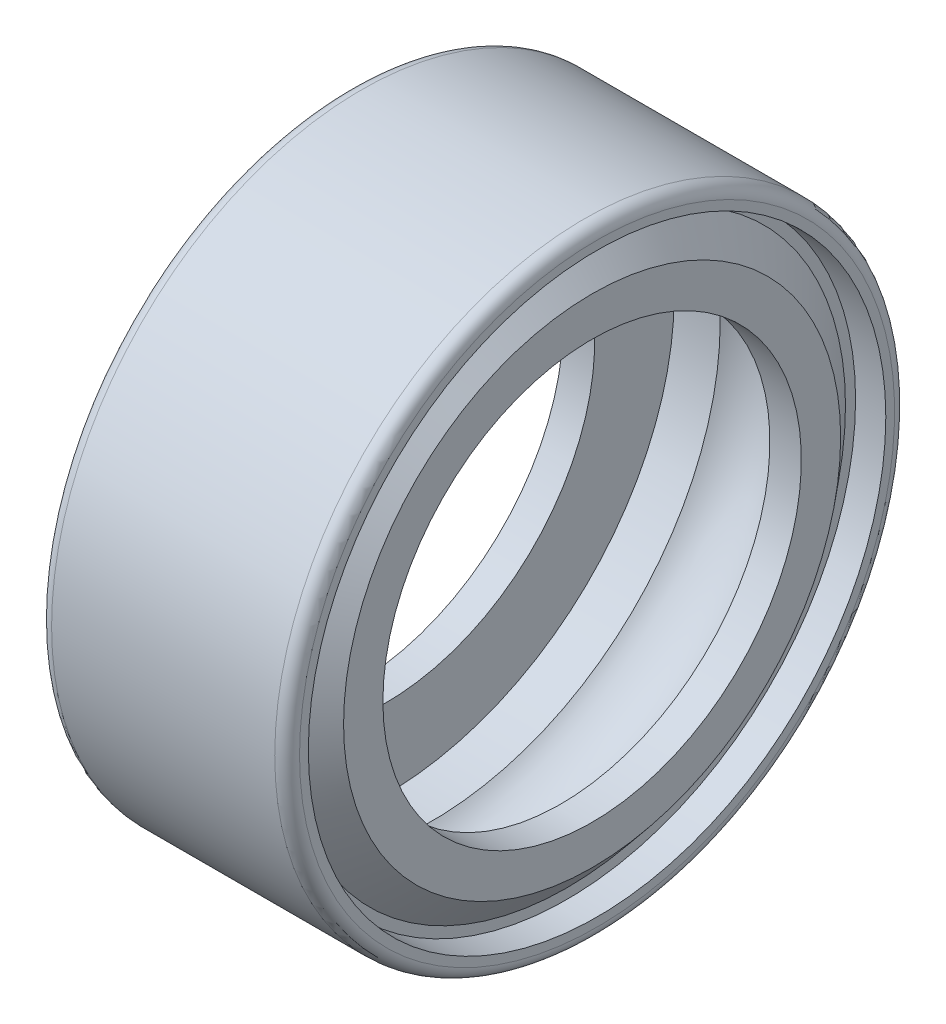
ISO-10303-21;
HEADER;
FILE_DESCRIPTION(('STEP AP214'),'2;1');
FILE_NAME('part.step','',(''),(''),'','','');
FILE_SCHEMA(('AUTOMOTIVE_DESIGN { 1 0 10303 214 1 1 1 1 }'));
ENDSEC;
DATA;
#1=APPLICATION_CONTEXT('core data for automotive mechanical design processes');
#2=APPLICATION_PROTOCOL_DEFINITION('international standard','automotive_design',2000,#1);
#3=PRODUCT_CONTEXT('',#1,'mechanical');
#4=PRODUCT('Part','Part','',(#3));
#5=PRODUCT_RELATED_PRODUCT_CATEGORY('part','',(#4));
#6=PRODUCT_DEFINITION_FORMATION('','',#4);
#7=PRODUCT_DEFINITION_CONTEXT('part definition',#1,'design');
#8=PRODUCT_DEFINITION('design','',#6,#7);
#9=PRODUCT_DEFINITION_SHAPE('','',#8);
#10=(LENGTH_UNIT() NAMED_UNIT(*) SI_UNIT(.MILLI.,.METRE.));
#11=(NAMED_UNIT(*) PLANE_ANGLE_UNIT() SI_UNIT($,.RADIAN.));
#12=(NAMED_UNIT(*) SI_UNIT($,.STERADIAN.) SOLID_ANGLE_UNIT());
#13=UNCERTAINTY_MEASURE_WITH_UNIT(LENGTH_MEASURE(1.E-05),#10,'distance_accuracy_value','');
#14=(GEOMETRIC_REPRESENTATION_CONTEXT(3) GLOBAL_UNCERTAINTY_ASSIGNED_CONTEXT((#13)) GLOBAL_UNIT_ASSIGNED_CONTEXT((#10,
#11,#12)) REPRESENTATION_CONTEXT('',''));
#15=CARTESIAN_POINT('',(0.,0.,0.));
#16=DIRECTION('',(0.,0.,1.));
#17=DIRECTION('',(1.,0.,0.));
#18=AXIS2_PLACEMENT_3D('',#15,#16,#17);
#19=CARTESIAN_POINT('',(-1.524,2.679239625,0.));
#20=DIRECTION('',(-1.,0.,0.));
#21=DIRECTION('',(0.,0.,1.));
#22=AXIS2_PLACEMENT_3D('',#19,#20,#21);
#23=PLANE('',#22);
#24=CARTESIAN_POINT('',(-1.524,0.,0.));
#25=DIRECTION('',(-1.,0.,0.));
#26=DIRECTION('',(0.,0.,1.));
#27=AXIS2_PLACEMENT_3D('',#24,#25,#26);
#28=CIRCLE('',#27,3.18255113425);
#29=CARTESIAN_POINT('',(-1.524,0.,3.18255113425));
#30=VERTEX_POINT('',#29);
#31=EDGE_CURVE('E10',#30,#30,#28,.T.);
#32=ORIENTED_EDGE('',*,*,#31,.T.);
#33=EDGE_LOOP('',(#32));
#34=FACE_BOUND('',#33,.T.);
#35=CARTESIAN_POINT('',(-1.524,0.,0.));
#36=DIRECTION('',(-1.,0.,0.));
#37=DIRECTION('',(0.,0.,1.));
#38=AXIS2_PLACEMENT_3D('',#35,#36,#37);
#39=CIRCLE('',#38,2.679239625);
#40=CARTESIAN_POINT('',(-1.524,0.,2.679239625));
#41=VERTEX_POINT('',#40);
#42=EDGE_CURVE('E97',#41,#41,#39,.T.);
#43=ORIENTED_EDGE('',*,*,#42,.F.);
#44=EDGE_LOOP('',(#43));
#45=FACE_BOUND('',#44,.T.);
#46=ADVANCED_FACE('F33',(#34,#45),#23,.T.);
#47=CARTESIAN_POINT('',(-1.524,0.,0.));
#48=DIRECTION('',(1.,0.,0.));
#49=DIRECTION('',(0.,0.,-1.));
#50=AXIS2_PLACEMENT_3D('',#47,#48,#49);
#51=CONICAL_SURFACE('',#50,3.18255113425,0.872664625997174);
#52=CARTESIAN_POINT('',(-1.20066864556187,0.,0.));
#53=DIRECTION('',(-1.,0.,0.));
#54=DIRECTION('',(0.,0.,1.));
#55=AXIS2_PLACEMENT_3D('',#52,#53,#54);
#56=CIRCLE('',#55,3.5678824375);
#57=CARTESIAN_POINT('',(-1.20066864556187,0.,3.5678824375));
#58=VERTEX_POINT('',#57);
#59=EDGE_CURVE('E39',#58,#58,#56,.T.);
#60=ORIENTED_EDGE('',*,*,#59,.T.);
#61=EDGE_LOOP('',(#60));
#62=FACE_BOUND('',#61,.T.);
#63=ORIENTED_EDGE('',*,*,#31,.F.);
#64=EDGE_LOOP('',(#63));
#65=FACE_BOUND('',#64,.T.);
#66=ADVANCED_FACE('F105',(#62,#65),#51,.T.);
#67=CARTESIAN_POINT('',(-1.20066864556187,3.5678824375,0.));
#68=DIRECTION('',(-1.,0.,0.));
#69=DIRECTION('',(0.,0.,1.));
#70=AXIS2_PLACEMENT_3D('',#67,#68,#69);
#71=PLANE('',#70);
#72=CARTESIAN_POINT('',(-1.20066864556186,0.,0.));
#73=DIRECTION('',(-1.,0.,0.));
#74=DIRECTION('',(0.,0.,1.));
#75=AXIS2_PLACEMENT_3D('',#72,#73,#74);
#76=CIRCLE('',#75,3.6972875);
#77=CARTESIAN_POINT('',(-1.20066864556186,0.,3.6972875));
#78=VERTEX_POINT('',#77);
#79=EDGE_CURVE('E43',#78,#78,#76,.T.);
#80=ORIENTED_EDGE('',*,*,#79,.T.);
#81=EDGE_LOOP('',(#80));
#82=FACE_BOUND('',#81,.T.);
#83=ORIENTED_EDGE('',*,*,#59,.F.);
#84=EDGE_LOOP('',(#83));
#85=FACE_BOUND('',#84,.T.);
#86=ADVANCED_FACE('F109',(#82,#85),#71,.T.);
#87=CARTESIAN_POINT('',(1.5875,0.,0.));
#88=DIRECTION('',(-1.,0.,0.));
#89=DIRECTION('',(0.,0.,1.));
#90=AXIS2_PLACEMENT_3D('',#87,#88,#89);
#91=CYLINDRICAL_SURFACE('',#90,3.6972875);
#92=CARTESIAN_POINT('',(-1.5875,0.,0.));
#93=DIRECTION('',(-1.,0.,0.));
#94=DIRECTION('',(0.,0.,1.));
#95=AXIS2_PLACEMENT_3D('',#92,#93,#94);
#96=CIRCLE('',#95,3.6972875);
#97=CARTESIAN_POINT('',(-1.5875,0.,3.6972875));
#98=VERTEX_POINT('',#97);
#99=EDGE_CURVE('E47',#98,#98,#96,.T.);
#100=ORIENTED_EDGE('',*,*,#99,.T.);
#101=EDGE_LOOP('',(#100));
#102=FACE_BOUND('',#101,.T.);
#103=ORIENTED_EDGE('',*,*,#79,.F.);
#104=EDGE_LOOP('',(#103));
#105=FACE_BOUND('',#104,.T.);
#106=ADVANCED_FACE('F113',(#102,#105),#91,.F.);
#107=CARTESIAN_POINT('',(-1.5875,3.6972875,0.));
#108=DIRECTION('',(-1.,0.,0.));
#109=DIRECTION('',(0.,0.,1.));
#110=AXIS2_PLACEMENT_3D('',#107,#108,#109);
#111=PLANE('',#110);
#112=CARTESIAN_POINT('',(-1.5875,0.,0.));
#113=DIRECTION('',(-1.,0.,0.));
#114=DIRECTION('',(0.,0.,1.));
#115=AXIS2_PLACEMENT_3D('',#112,#113,#114);
#116=CIRCLE('',#115,3.81);
#117=CARTESIAN_POINT('',(-1.5875,0.,3.81));
#118=VERTEX_POINT('',#117);
#119=EDGE_CURVE('E52',#118,#118,#116,.T.);
#120=ORIENTED_EDGE('',*,*,#119,.T.);
#121=EDGE_LOOP('',(#120));
#122=FACE_BOUND('',#121,.T.);
#123=ORIENTED_EDGE('',*,*,#99,.F.);
#124=EDGE_LOOP('',(#123));
#125=FACE_BOUND('',#124,.T.);
#126=ADVANCED_FACE('F120',(#122,#125),#111,.T.);
#127=CARTESIAN_POINT('',(-1.42875,0.,0.));
#128=DIRECTION('',(-1.,0.,0.));
#129=DIRECTION('',(0.,0.,1.));
#130=AXIS2_PLACEMENT_3D('',#127,#128,#129);
#131=TOROIDAL_SURFACE('',#130,3.81,0.15875);
#132=CARTESIAN_POINT('',(-1.42875,0.,0.));
#133=DIRECTION('',(-1.,0.,0.));
#134=DIRECTION('',(0.,0.,1.));
#135=AXIS2_PLACEMENT_3D('',#132,#133,#134);
#136=CIRCLE('',#135,3.96875);
#137=CARTESIAN_POINT('',(-1.42875,0.,3.96875));
#138=VERTEX_POINT('',#137);
#139=EDGE_CURVE('E55',#138,#138,#136,.T.);
#140=ORIENTED_EDGE('',*,*,#139,.T.);
#141=EDGE_LOOP('',(#140));
#142=FACE_BOUND('',#141,.T.);
#143=ORIENTED_EDGE('',*,*,#119,.F.);
#144=EDGE_LOOP('',(#143));
#145=FACE_BOUND('',#144,.T.);
#146=ADVANCED_FACE('F124',(#142,#145),#131,.T.);
#147=CARTESIAN_POINT('',(1.5875,0.,0.));
#148=DIRECTION('',(-1.,0.,0.));
#149=DIRECTION('',(0.,0.,1.));
#150=AXIS2_PLACEMENT_3D('',#147,#148,#149);
#151=CYLINDRICAL_SURFACE('',#150,3.96875);
#152=CARTESIAN_POINT('',(1.42875,0.,0.));
#153=DIRECTION('',(-1.,0.,0.));
#154=DIRECTION('',(0.,0.,1.));
#155=AXIS2_PLACEMENT_3D('',#152,#153,#154);
#156=CIRCLE('',#155,3.96875);
#157=CARTESIAN_POINT('',(1.42875,0.,3.96875));
#158=VERTEX_POINT('',#157);
#159=EDGE_CURVE('E58',#158,#158,#156,.T.);
#160=ORIENTED_EDGE('',*,*,#159,.T.);
#161=EDGE_LOOP('',(#160));
#162=FACE_BOUND('',#161,.T.);
#163=ORIENTED_EDGE('',*,*,#139,.F.);
#164=EDGE_LOOP('',(#163));
#165=FACE_BOUND('',#164,.T.);
#166=ADVANCED_FACE('F128',(#162,#165),#151,.T.);
#167=CARTESIAN_POINT('',(1.42875,0.,0.));
#168=DIRECTION('',(-1.,0.,0.));
#169=DIRECTION('',(0.,0.,1.));
#170=AXIS2_PLACEMENT_3D('',#167,#168,#169);
#171=TOROIDAL_SURFACE('',#170,3.81,0.15875);
#172=CARTESIAN_POINT('',(1.5875,0.,0.));
#173=DIRECTION('',(-1.,0.,0.));
#174=DIRECTION('',(0.,0.,1.));
#175=AXIS2_PLACEMENT_3D('',#172,#173,#174);
#176=CIRCLE('',#175,3.81);
#177=CARTESIAN_POINT('',(1.5875,0.,3.81));
#178=VERTEX_POINT('',#177);
#179=EDGE_CURVE('E61',#178,#178,#176,.T.);
#180=ORIENTED_EDGE('',*,*,#179,.T.);
#181=EDGE_LOOP('',(#180));
#182=FACE_BOUND('',#181,.T.);
#183=ORIENTED_EDGE('',*,*,#159,.F.);
#184=EDGE_LOOP('',(#183));
#185=FACE_BOUND('',#184,.T.);
#186=ADVANCED_FACE('F132',(#182,#185),#171,.T.);
#187=CARTESIAN_POINT('',(1.5875,3.81,0.));
#188=DIRECTION('',(1.,0.,0.));
#189=DIRECTION('',(0.,0.,-1.));
#190=AXIS2_PLACEMENT_3D('',#187,#188,#189);
#191=PLANE('',#190);
#192=CARTESIAN_POINT('',(1.5875,0.,0.));
#193=DIRECTION('',(-1.,0.,0.));
#194=DIRECTION('',(0.,0.,1.));
#195=AXIS2_PLACEMENT_3D('',#192,#193,#194);
#196=CIRCLE('',#195,3.6972875);
#197=CARTESIAN_POINT('',(1.5875,0.,3.6972875));
#198=VERTEX_POINT('',#197);
#199=EDGE_CURVE('E64',#198,#198,#196,.T.);
#200=ORIENTED_EDGE('',*,*,#199,.T.);
#201=EDGE_LOOP('',(#200));
#202=FACE_BOUND('',#201,.T.);
#203=ORIENTED_EDGE('',*,*,#179,.F.);
#204=EDGE_LOOP('',(#203));
#205=FACE_BOUND('',#204,.T.);
#206=ADVANCED_FACE('F136',(#202,#205),#191,.T.);
#207=CARTESIAN_POINT('',(1.5875,0.,0.));
#208=DIRECTION('',(-1.,0.,0.));
#209=DIRECTION('',(0.,0.,1.));
#210=AXIS2_PLACEMENT_3D('',#207,#208,#209);
#211=CYLINDRICAL_SURFACE('',#210,3.6972875);
#212=CARTESIAN_POINT('',(1.20066864556186,0.,0.));
#213=DIRECTION('',(-1.,0.,0.));
#214=DIRECTION('',(0.,0.,1.));
#215=AXIS2_PLACEMENT_3D('',#212,#213,#214);
#216=CIRCLE('',#215,3.6972875);
#217=CARTESIAN_POINT('',(1.20066864556186,0.,3.6972875));
#218=VERTEX_POINT('',#217);
#219=EDGE_CURVE('E67',#218,#218,#216,.T.);
#220=ORIENTED_EDGE('',*,*,#219,.T.);
#221=EDGE_LOOP('',(#220));
#222=FACE_BOUND('',#221,.T.);
#223=ORIENTED_EDGE('',*,*,#199,.F.);
#224=EDGE_LOOP('',(#223));
#225=FACE_BOUND('',#224,.T.);
#226=ADVANCED_FACE('F140',(#222,#225),#211,.F.);
#227=CARTESIAN_POINT('',(1.20066864556187,3.6972875,0.));
#228=DIRECTION('',(1.,0.,0.));
#229=DIRECTION('',(0.,0.,-1.));
#230=AXIS2_PLACEMENT_3D('',#227,#228,#229);
#231=PLANE('',#230);
#232=CARTESIAN_POINT('',(1.20066864556187,0.,0.));
#233=DIRECTION('',(-1.,0.,0.));
#234=DIRECTION('',(0.,0.,1.));
#235=AXIS2_PLACEMENT_3D('',#232,#233,#234);
#236=CIRCLE('',#235,3.5678824375);
#237=CARTESIAN_POINT('',(1.20066864556187,0.,3.5678824375));
#238=VERTEX_POINT('',#237);
#239=EDGE_CURVE('E70',#238,#238,#236,.T.);
#240=ORIENTED_EDGE('',*,*,#239,.T.);
#241=EDGE_LOOP('',(#240));
#242=FACE_BOUND('',#241,.T.);
#243=ORIENTED_EDGE('',*,*,#219,.F.);
#244=EDGE_LOOP('',(#243));
#245=FACE_BOUND('',#244,.T.);
#246=ADVANCED_FACE('F144',(#242,#245),#231,.T.);
#247=CARTESIAN_POINT('',(1.20066864556187,0.,0.));
#248=DIRECTION('',(-1.,0.,0.));
#249=DIRECTION('',(0.,0.,1.));
#250=AXIS2_PLACEMENT_3D('',#247,#248,#249);
#251=CONICAL_SURFACE('',#250,3.5678824375,0.872664625997174);
#252=CARTESIAN_POINT('',(1.524,0.,0.));
#253=DIRECTION('',(-1.,0.,0.));
#254=DIRECTION('',(0.,0.,1.));
#255=AXIS2_PLACEMENT_3D('',#252,#253,#254);
#256=CIRCLE('',#255,3.18255113425);
#257=CARTESIAN_POINT('',(1.524,0.,3.18255113425));
#258=VERTEX_POINT('',#257);
#259=EDGE_CURVE('E73',#258,#258,#256,.T.);
#260=ORIENTED_EDGE('',*,*,#259,.T.);
#261=EDGE_LOOP('',(#260));
#262=FACE_BOUND('',#261,.T.);
#263=ORIENTED_EDGE('',*,*,#239,.F.);
#264=EDGE_LOOP('',(#263));
#265=FACE_BOUND('',#264,.T.);
#266=ADVANCED_FACE('F148',(#262,#265),#251,.T.);
#267=CARTESIAN_POINT('',(1.524,3.18255113425,0.));
#268=DIRECTION('',(1.,0.,0.));
#269=DIRECTION('',(0.,0.,-1.));
#270=AXIS2_PLACEMENT_3D('',#267,#268,#269);
#271=PLANE('',#270);
#272=CARTESIAN_POINT('',(1.524,0.,0.));
#273=DIRECTION('',(-1.,0.,0.));
#274=DIRECTION('',(0.,0.,1.));
#275=AXIS2_PLACEMENT_3D('',#272,#273,#274);
#276=CIRCLE('',#275,2.679239625);
#277=CARTESIAN_POINT('',(1.524,0.,2.679239625));
#278=VERTEX_POINT('',#277);
#279=EDGE_CURVE('E76',#278,#278,#276,.T.);
#280=ORIENTED_EDGE('',*,*,#279,.T.);
#281=EDGE_LOOP('',(#280));
#282=FACE_BOUND('',#281,.T.);
#283=ORIENTED_EDGE('',*,*,#259,.F.);
#284=EDGE_LOOP('',(#283));
#285=FACE_BOUND('',#284,.T.);
#286=ADVANCED_FACE('F152',(#282,#285),#271,.T.);
#287=CARTESIAN_POINT('',(1.5875,0.,0.));
#288=DIRECTION('',(-1.,0.,0.));
#289=DIRECTION('',(0.,0.,1.));
#290=AXIS2_PLACEMENT_3D('',#287,#288,#289);
#291=CYLINDRICAL_SURFACE('',#290,2.679239625);
#292=CARTESIAN_POINT('',(1.12129364556186,0.,0.));
#293=DIRECTION('',(-1.,0.,0.));
#294=DIRECTION('',(0.,0.,1.));
#295=AXIS2_PLACEMENT_3D('',#292,#293,#294);
#296=CIRCLE('',#295,2.679239625);
#297=CARTESIAN_POINT('',(1.12129364556186,0.,2.679239625));
#298=VERTEX_POINT('',#297);
#299=EDGE_CURVE('E79',#298,#298,#296,.T.);
#300=ORIENTED_EDGE('',*,*,#299,.T.);
#301=EDGE_LOOP('',(#300));
#302=FACE_BOUND('',#301,.T.);
#303=ORIENTED_EDGE('',*,*,#279,.F.);
#304=EDGE_LOOP('',(#303));
#305=FACE_BOUND('',#304,.T.);
#306=ADVANCED_FACE('F156',(#302,#305),#291,.F.);
#307=CARTESIAN_POINT('',(1.12129364556186,2.679239625,0.));
#308=DIRECTION('',(-1.,0.,0.));
#309=DIRECTION('',(0.,0.,1.));
#310=AXIS2_PLACEMENT_3D('',#307,#308,#309);
#311=PLANE('',#310);
#312=CARTESIAN_POINT('',(1.12129364556186,0.,0.));
#313=DIRECTION('',(-1.,0.,0.));
#314=DIRECTION('',(0.,0.,1.));
#315=AXIS2_PLACEMENT_3D('',#312,#313,#314);
#316=CIRCLE('',#315,3.6972875);
#317=CARTESIAN_POINT('',(1.12129364556186,0.,3.6972875));
#318=VERTEX_POINT('',#317);
#319=EDGE_CURVE('E82',#318,#318,#316,.T.);
#320=ORIENTED_EDGE('',*,*,#319,.T.);
#321=EDGE_LOOP('',(#320));
#322=FACE_BOUND('',#321,.T.);
#323=ORIENTED_EDGE('',*,*,#299,.F.);
#324=EDGE_LOOP('',(#323));
#325=FACE_BOUND('',#324,.T.);
#326=ADVANCED_FACE('F160',(#322,#325),#311,.T.);
#327=CARTESIAN_POINT('',(1.5875,0.,0.));
#328=DIRECTION('',(-1.,0.,0.));
#329=DIRECTION('',(0.,0.,1.));
#330=AXIS2_PLACEMENT_3D('',#327,#328,#329);
#331=CYLINDRICAL_SURFACE('',#330,3.6972875);
#332=CARTESIAN_POINT('',(0.532839828624654,0.,0.));
#333=DIRECTION('',(-1.,0.,0.));
#334=DIRECTION('',(0.,0.,1.));
#335=AXIS2_PLACEMENT_3D('',#332,#333,#334);
#336=CIRCLE('',#335,3.6972875);
#337=CARTESIAN_POINT('',(0.532839828624654,0.,3.6972875));
#338=VERTEX_POINT('',#337);
#339=EDGE_CURVE('E85',#338,#338,#336,.T.);
#340=ORIENTED_EDGE('',*,*,#339,.T.);
#341=EDGE_LOOP('',(#340));
#342=FACE_BOUND('',#341,.T.);
#343=ORIENTED_EDGE('',*,*,#319,.F.);
#344=EDGE_LOOP('',(#343));
#345=FACE_BOUND('',#344,.T.);
#346=ADVANCED_FACE('F164',(#342,#345),#331,.F.);
#347=CARTESIAN_POINT('',(0.,0.,0.));
#348=DIRECTION('',(-1.,0.,0.));
#349=DIRECTION('',(0.,0.,1.));
#350=AXIS2_PLACEMENT_3D('',#347,#348,#349);
#351=TOROIDAL_SURFACE('',#350,3.175,0.746125);
#352=CARTESIAN_POINT('',(-0.532839828624654,0.,0.));
#353=DIRECTION('',(-1.,0.,0.));
#354=DIRECTION('',(0.,0.,1.));
#355=AXIS2_PLACEMENT_3D('',#352,#353,#354);
#356=CIRCLE('',#355,3.6972875);
#357=CARTESIAN_POINT('',(-0.532839828624654,0.,3.6972875));
#358=VERTEX_POINT('',#357);
#359=EDGE_CURVE('E88',#358,#358,#356,.T.);
#360=ORIENTED_EDGE('',*,*,#359,.T.);
#361=EDGE_LOOP('',(#360));
#362=FACE_BOUND('',#361,.T.);
#363=ORIENTED_EDGE('',*,*,#339,.F.);
#364=EDGE_LOOP('',(#363));
#365=FACE_BOUND('',#364,.T.);
#366=ADVANCED_FACE('F168',(#362,#365),#351,.F.);
#367=CARTESIAN_POINT('',(1.5875,0.,0.));
#368=DIRECTION('',(-1.,0.,0.));
#369=DIRECTION('',(0.,0.,1.));
#370=AXIS2_PLACEMENT_3D('',#367,#368,#369);
#371=CYLINDRICAL_SURFACE('',#370,3.6972875);
#372=CARTESIAN_POINT('',(-1.12129364556186,0.,0.));
#373=DIRECTION('',(-1.,0.,0.));
#374=DIRECTION('',(0.,0.,1.));
#375=AXIS2_PLACEMENT_3D('',#372,#373,#374);
#376=CIRCLE('',#375,3.6972875);
#377=CARTESIAN_POINT('',(-1.12129364556186,0.,3.6972875));
#378=VERTEX_POINT('',#377);
#379=EDGE_CURVE('E91',#378,#378,#376,.T.);
#380=ORIENTED_EDGE('',*,*,#379,.T.);
#381=EDGE_LOOP('',(#380));
#382=FACE_BOUND('',#381,.T.);
#383=ORIENTED_EDGE('',*,*,#359,.F.);
#384=EDGE_LOOP('',(#383));
#385=FACE_BOUND('',#384,.T.);
#386=ADVANCED_FACE('F172',(#382,#385),#371,.F.);
#387=CARTESIAN_POINT('',(-1.12129364556186,3.6972875,0.));
#388=DIRECTION('',(1.,0.,0.));
#389=DIRECTION('',(0.,0.,-1.));
#390=AXIS2_PLACEMENT_3D('',#387,#388,#389);
#391=PLANE('',#390);
#392=CARTESIAN_POINT('',(-1.12129364556186,0.,0.));
#393=DIRECTION('',(-1.,0.,0.));
#394=DIRECTION('',(0.,0.,1.));
#395=AXIS2_PLACEMENT_3D('',#392,#393,#394);
#396=CIRCLE('',#395,2.679239625);
#397=CARTESIAN_POINT('',(-1.12129364556186,0.,2.679239625));
#398=VERTEX_POINT('',#397);
#399=EDGE_CURVE('E94',#398,#398,#396,.T.);
#400=ORIENTED_EDGE('',*,*,#399,.T.);
#401=EDGE_LOOP('',(#400));
#402=FACE_BOUND('',#401,.T.);
#403=ORIENTED_EDGE('',*,*,#379,.F.);
#404=EDGE_LOOP('',(#403));
#405=FACE_BOUND('',#404,.T.);
#406=ADVANCED_FACE('F176',(#402,#405),#391,.T.);
#407=CARTESIAN_POINT('',(1.5875,0.,0.));
#408=DIRECTION('',(-1.,0.,0.));
#409=DIRECTION('',(0.,0.,1.));
#410=AXIS2_PLACEMENT_3D('',#407,#408,#409);
#411=CYLINDRICAL_SURFACE('',#410,2.679239625);
#412=ORIENTED_EDGE('',*,*,#42,.T.);
#413=EDGE_LOOP('',(#412));
#414=FACE_BOUND('',#413,.T.);
#415=ORIENTED_EDGE('',*,*,#399,.F.);
#416=EDGE_LOOP('',(#415));
#417=FACE_BOUND('',#416,.T.);
#418=ADVANCED_FACE('F101',(#414,#417),#411,.F.);
#419=CLOSED_SHELL('',(#46,#66,#86,#106,#126,#146,#166,#186,#206,#226,#246,#266,#286,#306,#326,
#346,#366,#386,#406,#418));
#420=MANIFOLD_SOLID_BREP('B2',#419);
#421=ADVANCED_BREP_SHAPE_REPRESENTATION('',(#18,#420),#14);
#422=SHAPE_DEFINITION_REPRESENTATION(#9,#421);
ENDSEC;
END-ISO-10303-21;
